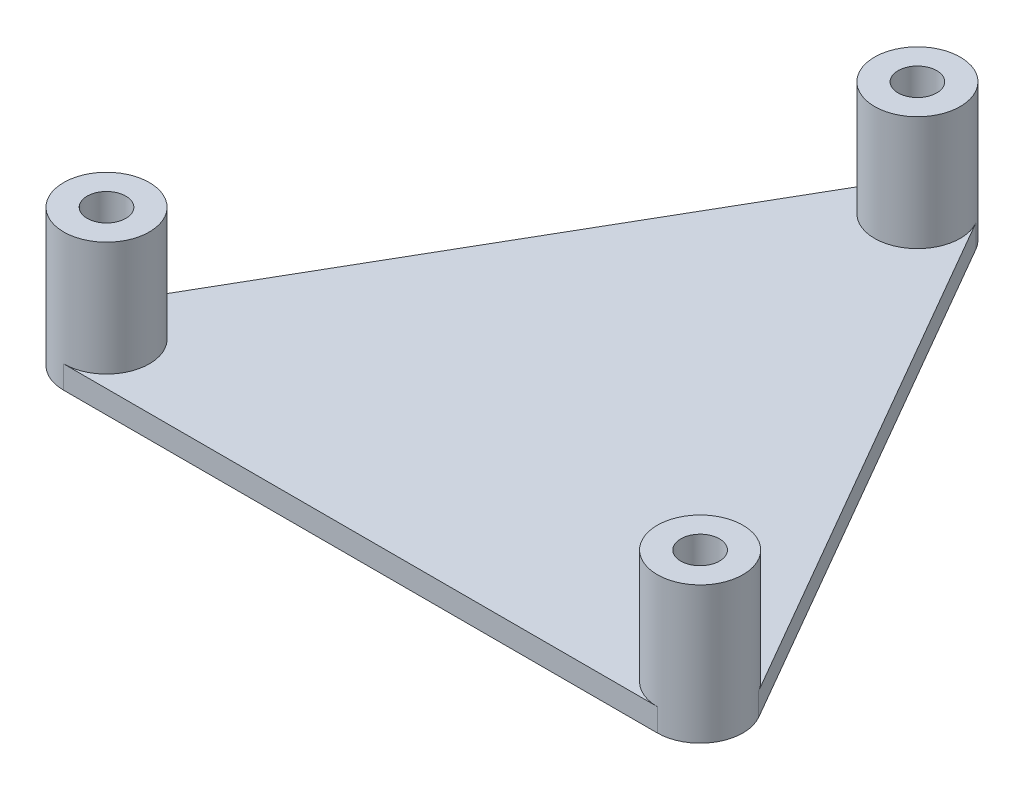
ISO-10303-21;
HEADER;
FILE_DESCRIPTION(('STEP AP214'),'2;1');
FILE_NAME('part.step','',(''),(''),'','','');
FILE_SCHEMA(('AUTOMOTIVE_DESIGN { 1 0 10303 214 1 1 1 1 }'));
ENDSEC;
DATA;
#1=APPLICATION_CONTEXT('core data for automotive mechanical design processes');
#2=APPLICATION_PROTOCOL_DEFINITION('international standard','automotive_design',2000,#1);
#3=PRODUCT_CONTEXT('',#1,'mechanical');
#4=PRODUCT('Part','Part','',(#3));
#5=PRODUCT_RELATED_PRODUCT_CATEGORY('part','',(#4));
#6=PRODUCT_DEFINITION_FORMATION('','',#4);
#7=PRODUCT_DEFINITION_CONTEXT('part definition',#1,'design');
#8=PRODUCT_DEFINITION('design','',#6,#7);
#9=PRODUCT_DEFINITION_SHAPE('','',#8);
#10=(LENGTH_UNIT() NAMED_UNIT(*) SI_UNIT(.MILLI.,.METRE.));
#11=(NAMED_UNIT(*) PLANE_ANGLE_UNIT() SI_UNIT($,.RADIAN.));
#12=(NAMED_UNIT(*) SI_UNIT($,.STERADIAN.) SOLID_ANGLE_UNIT());
#13=UNCERTAINTY_MEASURE_WITH_UNIT(LENGTH_MEASURE(1.E-05),#10,'distance_accuracy_value','');
#14=(GEOMETRIC_REPRESENTATION_CONTEXT(3) GLOBAL_UNCERTAINTY_ASSIGNED_CONTEXT((#13)) GLOBAL_UNIT_ASSIGNED_CONTEXT((#10,
#11,#12)) REPRESENTATION_CONTEXT('',''));
#15=CARTESIAN_POINT('',(0.,0.,0.));
#16=DIRECTION('',(0.,0.,1.));
#17=DIRECTION('',(1.,0.,0.));
#18=AXIS2_PLACEMENT_3D('',#15,#16,#17);
#19=CARTESIAN_POINT('',(0.,2.54,0.));
#20=DIRECTION('',(0.,1.,0.));
#21=DIRECTION('',(0.,0.,1.));
#22=AXIS2_PLACEMENT_3D('',#19,#20,#21);
#23=PLANE('',#22);
#24=DIRECTION('',(-0.499999999999972,0.,0.866025403784455));
#25=VECTOR('',#24,1.);
#26=CARTESIAN_POINT('',(-20.6222299276164,2.54,-11.9062499999988));
#27=LINE('',#26,#25);
#28=CARTESIAN_POINT('',(-4.12444598552347,2.54,-40.4812499999999));
#29=VERTEX_POINT('',#28);
#30=CARTESIAN_POINT('',(-37.1200138697081,2.54,16.6687500000001));
#31=VERTEX_POINT('',#30);
#32=EDGE_CURVE('E162',#29,#31,#27,.T.);
#33=ORIENTED_EDGE('',*,*,#32,.T.);
#34=CARTESIAN_POINT('',(-32.9955678841846,2.54,19.05));
#35=DIRECTION('',(0.,1.,0.));
#36=DIRECTION('',(0.,0.,1.));
#37=AXIS2_PLACEMENT_3D('',#34,#35,#36);
#38=CIRCLE('',#37,4.7625);
#39=CARTESIAN_POINT('',(-32.9955678841846,2.54,23.8125));
#40=VERTEX_POINT('',#39);
#41=EDGE_CURVE('E157',#40,#31,#38,.T.);
#42=ORIENTED_EDGE('',*,*,#41,.F.);
#43=DIRECTION('',(1.,0.,0.));
#44=VECTOR('',#43,1.);
#45=CARTESIAN_POINT('',(0.,2.54,23.8125));
#46=LINE('',#45,#44);
#47=CARTESIAN_POINT('',(32.9955678841883,2.54,23.8125));
#48=VERTEX_POINT('',#47);
#49=EDGE_CURVE('E143',#40,#48,#46,.T.);
#50=ORIENTED_EDGE('',*,*,#49,.T.);
#51=CARTESIAN_POINT('',(32.9955678841883,2.54,19.0499999999979));
#52=DIRECTION('',(0.,1.,0.));
#53=DIRECTION('',(0.,0.,1.));
#54=AXIS2_PLACEMENT_3D('',#51,#52,#53);
#55=CIRCLE('',#54,4.7625);
#56=CARTESIAN_POINT('',(37.1200138697117,2.54,16.6687499999977));
#57=VERTEX_POINT('',#56);
#58=EDGE_CURVE('E176',#57,#48,#55,.T.);
#59=ORIENTED_EDGE('',*,*,#58,.F.);
#60=DIRECTION('',(0.500000000000028,0.,0.866025403784422));
#61=VECTOR('',#60,1.);
#62=CARTESIAN_POINT('',(20.6222299276175,2.54,-11.9062500000012));
#63=LINE('',#62,#61);
#64=CARTESIAN_POINT('',(4.12444598552331,2.54,-40.4812500000001));
#65=VERTEX_POINT('',#64);
#66=EDGE_CURVE('E194',#65,#57,#63,.T.);
#67=ORIENTED_EDGE('',*,*,#66,.F.);
#68=CARTESIAN_POINT('',(0.,2.54,-38.1));
#69=DIRECTION('',(0.,1.,0.));
#70=DIRECTION('',(0.,0.,1.));
#71=AXIS2_PLACEMENT_3D('',#68,#69,#70);
#72=CIRCLE('',#71,4.7625);
#73=EDGE_CURVE('E12',#29,#65,#72,.T.);
#74=ORIENTED_EDGE('',*,*,#73,.F.);
#75=EDGE_LOOP('',(#33,#42,#50,#59,#67,#74));
#76=FACE_BOUND('',#75,.T.);
#77=ADVANCED_FACE('F83',(#76),#23,.T.);
#78=CARTESIAN_POINT('',(0.,0.,0.));
#79=DIRECTION('',(0.,1.,0.));
#80=DIRECTION('',(0.,0.,1.));
#81=AXIS2_PLACEMENT_3D('',#78,#79,#80);
#82=PLANE('',#81);
#83=CARTESIAN_POINT('',(-32.9955678841846,0.,19.05));
#84=DIRECTION('',(0.,1.,0.));
#85=DIRECTION('',(0.,0.,1.));
#86=AXIS2_PLACEMENT_3D('',#83,#84,#85);
#87=CIRCLE('',#86,2.15);
#88=CARTESIAN_POINT('',(-32.9955678841846,0.,21.2));
#89=VERTEX_POINT('',#88);
#90=EDGE_CURVE('E204',#89,#89,#87,.T.);
#91=ORIENTED_EDGE('',*,*,#90,.T.);
#92=EDGE_LOOP('',(#91));
#93=FACE_BOUND('',#92,.T.);
#94=CARTESIAN_POINT('',(0.,0.,-38.1));
#95=DIRECTION('',(0.,1.,0.));
#96=DIRECTION('',(0.,0.,1.));
#97=AXIS2_PLACEMENT_3D('',#94,#95,#96);
#98=CIRCLE('',#97,2.15);
#99=CARTESIAN_POINT('',(0.,0.,-35.95));
#100=VERTEX_POINT('',#99);
#101=EDGE_CURVE('E93',#100,#100,#98,.T.);
#102=ORIENTED_EDGE('',*,*,#101,.T.);
#103=EDGE_LOOP('',(#102));
#104=FACE_BOUND('',#103,.T.);
#105=CARTESIAN_POINT('',(32.9955678841883,0.,19.0499999999979));
#106=DIRECTION('',(0.,1.,0.));
#107=DIRECTION('',(0.,0.,1.));
#108=AXIS2_PLACEMENT_3D('',#105,#106,#107);
#109=CIRCLE('',#108,2.15);
#110=CARTESIAN_POINT('',(32.9955678841883,0.,21.1999999999979));
#111=VERTEX_POINT('',#110);
#112=EDGE_CURVE('E207',#111,#111,#109,.T.);
#113=ORIENTED_EDGE('',*,*,#112,.T.);
#114=EDGE_LOOP('',(#113));
#115=FACE_BOUND('',#114,.T.);
#116=CARTESIAN_POINT('',(0.,0.,-38.1));
#117=DIRECTION('',(0.,1.,0.));
#118=DIRECTION('',(0.,0.,1.));
#119=AXIS2_PLACEMENT_3D('',#116,#117,#118);
#120=CIRCLE('',#119,4.7625);
#121=CARTESIAN_POINT('',(4.12444598552332,0.,-40.4812500000001));
#122=VERTEX_POINT('',#121);
#123=CARTESIAN_POINT('',(-4.12444598552347,0.,-40.4812499999999));
#124=VERTEX_POINT('',#123);
#125=EDGE_CURVE('E102',#122,#124,#120,.T.);
#126=ORIENTED_EDGE('',*,*,#125,.F.);
#127=DIRECTION('',(0.500000000000028,0.,0.866025403784422));
#128=VECTOR('',#127,1.);
#129=CARTESIAN_POINT('',(20.6222299276175,0.,-11.9062500000012));
#130=LINE('',#129,#128);
#131=CARTESIAN_POINT('',(37.1200138697117,0.,16.6687499999977));
#132=VERTEX_POINT('',#131);
#133=EDGE_CURVE('E188',#122,#132,#130,.T.);
#134=ORIENTED_EDGE('',*,*,#133,.T.);
#135=CARTESIAN_POINT('',(32.9955678841883,0.,19.0499999999979));
#136=DIRECTION('',(0.,1.,0.));
#137=DIRECTION('',(0.,0.,1.));
#138=AXIS2_PLACEMENT_3D('',#135,#136,#137);
#139=CIRCLE('',#138,4.76250000000108);
#140=CARTESIAN_POINT('',(32.9955678841883,0.,23.8125));
#141=VERTEX_POINT('',#140);
#142=EDGE_CURVE('E160',#141,#132,#139,.T.);
#143=ORIENTED_EDGE('',*,*,#142,.F.);
#144=DIRECTION('',(1.,0.,0.));
#145=VECTOR('',#144,1.);
#146=CARTESIAN_POINT('',(0.,0.,23.8125));
#147=LINE('',#146,#145);
#148=CARTESIAN_POINT('',(-32.9955678841846,0.,23.8125));
#149=VERTEX_POINT('',#148);
#150=EDGE_CURVE('E122',#149,#141,#147,.T.);
#151=ORIENTED_EDGE('',*,*,#150,.F.);
#152=CARTESIAN_POINT('',(-32.9955678841846,0.,19.05));
#153=DIRECTION('',(0.,1.,0.));
#154=DIRECTION('',(0.,0.,1.));
#155=AXIS2_PLACEMENT_3D('',#152,#153,#154);
#156=CIRCLE('',#155,4.76250000000001);
#157=CARTESIAN_POINT('',(-37.1200138697081,0.,16.6687500000001));
#158=VERTEX_POINT('',#157);
#159=EDGE_CURVE('E159',#158,#149,#156,.T.);
#160=ORIENTED_EDGE('',*,*,#159,.F.);
#161=DIRECTION('',(-0.499999999999972,0.,0.866025403784455));
#162=VECTOR('',#161,1.);
#163=CARTESIAN_POINT('',(-20.6222299276164,0.,-11.9062499999988));
#164=LINE('',#163,#162);
#165=EDGE_CURVE('E200',#124,#158,#164,.T.);
#166=ORIENTED_EDGE('',*,*,#165,.F.);
#167=EDGE_LOOP('',(#126,#134,#143,#151,#160,#166));
#168=FACE_BOUND('',#167,.T.);
#169=ADVANCED_FACE('F85',(#93,#104,#115,#168),#82,.F.);
#170=CARTESIAN_POINT('',(0.,2.54,-38.1));
#171=DIRECTION('',(0.,-1.,0.));
#172=DIRECTION('',(0.,0.,-1.));
#173=AXIS2_PLACEMENT_3D('',#170,#171,#172);
#174=CYLINDRICAL_SURFACE('',#173,2.15);
#175=ORIENTED_EDGE('',*,*,#101,.F.);
#176=EDGE_LOOP('',(#175));
#177=FACE_BOUND('',#176,.T.);
#178=CARTESIAN_POINT('',(0.,15.24,-38.1));
#179=DIRECTION('',(0.,1.,0.));
#180=DIRECTION('',(0.,0.,1.));
#181=AXIS2_PLACEMENT_3D('',#178,#179,#180);
#182=CIRCLE('',#181,2.15);
#183=CARTESIAN_POINT('',(0.,15.24,-35.95));
#184=VERTEX_POINT('',#183);
#185=EDGE_CURVE('E180',#184,#184,#182,.T.);
#186=ORIENTED_EDGE('',*,*,#185,.T.);
#187=EDGE_LOOP('',(#186));
#188=FACE_BOUND('',#187,.T.);
#189=ADVANCED_FACE('F252',(#177,#188),#174,.F.);
#190=CARTESIAN_POINT('',(32.9955678841883,2.54,19.0499999999979));
#191=DIRECTION('',(0.,-1.,0.));
#192=DIRECTION('',(0.,0.,-1.));
#193=AXIS2_PLACEMENT_3D('',#190,#191,#192);
#194=CYLINDRICAL_SURFACE('',#193,2.15);
#195=ORIENTED_EDGE('',*,*,#112,.F.);
#196=EDGE_LOOP('',(#195));
#197=FACE_BOUND('',#196,.T.);
#198=CARTESIAN_POINT('',(32.9955678841883,15.24,19.0499999999979));
#199=DIRECTION('',(0.,1.,0.));
#200=DIRECTION('',(0.,0.,1.));
#201=AXIS2_PLACEMENT_3D('',#198,#199,#200);
#202=CIRCLE('',#201,2.15);
#203=CARTESIAN_POINT('',(32.9955678841883,15.24,21.1999999999979));
#204=VERTEX_POINT('',#203);
#205=EDGE_CURVE('E168',#204,#204,#202,.T.);
#206=ORIENTED_EDGE('',*,*,#205,.T.);
#207=EDGE_LOOP('',(#206));
#208=FACE_BOUND('',#207,.T.);
#209=ADVANCED_FACE('F257',(#197,#208),#194,.F.);
#210=CARTESIAN_POINT('',(-32.9955678841846,2.54,19.05));
#211=DIRECTION('',(0.,-1.,0.));
#212=DIRECTION('',(0.,0.,-1.));
#213=AXIS2_PLACEMENT_3D('',#210,#211,#212);
#214=CYLINDRICAL_SURFACE('',#213,2.15);
#215=ORIENTED_EDGE('',*,*,#90,.F.);
#216=EDGE_LOOP('',(#215));
#217=FACE_BOUND('',#216,.T.);
#218=CARTESIAN_POINT('',(-32.9955678841846,15.24,19.05));
#219=DIRECTION('',(0.,1.,0.));
#220=DIRECTION('',(0.,0.,1.));
#221=AXIS2_PLACEMENT_3D('',#218,#219,#220);
#222=CIRCLE('',#221,2.15);
#223=CARTESIAN_POINT('',(-32.9955678841846,15.24,21.2));
#224=VERTEX_POINT('',#223);
#225=EDGE_CURVE('E164',#224,#224,#222,.T.);
#226=ORIENTED_EDGE('',*,*,#225,.T.);
#227=EDGE_LOOP('',(#226));
#228=FACE_BOUND('',#227,.T.);
#229=ADVANCED_FACE('F261',(#217,#228),#214,.F.);
#230=CARTESIAN_POINT('',(0.,0.,-38.1));
#231=DIRECTION('',(0.,1.,0.));
#232=DIRECTION('',(0.,0.,1.));
#233=AXIS2_PLACEMENT_3D('',#230,#231,#232);
#234=CYLINDRICAL_SURFACE('',#233,4.7625);
#235=DIRECTION('',(0.,1.,0.));
#236=VECTOR('',#235,1.);
#237=CARTESIAN_POINT('',(-4.12444598552347,0.,-40.4812499999999));
#238=LINE('',#237,#236);
#239=EDGE_CURVE('E203',#124,#29,#238,.T.);
#240=ORIENTED_EDGE('',*,*,#239,.T.);
#241=ORIENTED_EDGE('',*,*,#73,.T.);
#242=DIRECTION('',(0.,1.,0.));
#243=VECTOR('',#242,1.);
#244=CARTESIAN_POINT('',(4.12444598552332,0.,-40.4812500000001));
#245=LINE('',#244,#243);
#246=EDGE_CURVE('E187',#122,#65,#245,.T.);
#247=ORIENTED_EDGE('',*,*,#246,.F.);
#248=ORIENTED_EDGE('',*,*,#125,.T.);
#249=EDGE_LOOP('',(#240,#241,#247,#248));
#250=FACE_BOUND('',#249,.T.);
#251=CARTESIAN_POINT('',(0.,15.24,-38.1));
#252=DIRECTION('',(0.,1.,0.));
#253=DIRECTION('',(0.,0.,1.));
#254=AXIS2_PLACEMENT_3D('',#251,#252,#253);
#255=CIRCLE('',#254,4.7625);
#256=CARTESIAN_POINT('',(0.,15.24,-33.3375));
#257=VERTEX_POINT('',#256);
#258=EDGE_CURVE('E184',#257,#257,#255,.T.);
#259=ORIENTED_EDGE('',*,*,#258,.F.);
#260=EDGE_LOOP('',(#259));
#261=FACE_BOUND('',#260,.T.);
#262=ADVANCED_FACE('F221',(#250,#261),#234,.T.);
#263=CARTESIAN_POINT('',(-20.6222299276164,0.,-11.9062499999988));
#264=DIRECTION('',(-0.866025403784455,0.,-0.499999999999972));
#265=DIRECTION('',(-0.499999999999972,0.,0.866025403784455));
#266=AXIS2_PLACEMENT_3D('',#263,#264,#265);
#267=PLANE('',#266);
#268=ORIENTED_EDGE('',*,*,#32,.F.);
#269=ORIENTED_EDGE('',*,*,#239,.F.);
#270=ORIENTED_EDGE('',*,*,#165,.T.);
#271=DIRECTION('',(0.,1.,0.));
#272=VECTOR('',#271,1.);
#273=CARTESIAN_POINT('',(-37.1200138697081,0.,16.6687500000001));
#274=LINE('',#273,#272);
#275=EDGE_CURVE('E113',#158,#31,#274,.T.);
#276=ORIENTED_EDGE('',*,*,#275,.T.);
#277=EDGE_LOOP('',(#268,#269,#270,#276));
#278=FACE_BOUND('',#277,.T.);
#279=ADVANCED_FACE('F224',(#278),#267,.T.);
#280=CARTESIAN_POINT('',(-32.9955678841846,0.,19.05));
#281=DIRECTION('',(0.,1.,0.));
#282=DIRECTION('',(0.,0.,1.));
#283=AXIS2_PLACEMENT_3D('',#280,#281,#282);
#284=CYLINDRICAL_SURFACE('',#283,4.76250000000001);
#285=DIRECTION('',(0.,1.,0.));
#286=VECTOR('',#285,1.);
#287=CARTESIAN_POINT('',(-32.9955678841846,0.,23.8125));
#288=LINE('',#287,#286);
#289=EDGE_CURVE('E146',#149,#40,#288,.T.);
#290=ORIENTED_EDGE('',*,*,#289,.T.);
#291=ORIENTED_EDGE('',*,*,#41,.T.);
#292=ORIENTED_EDGE('',*,*,#275,.F.);
#293=ORIENTED_EDGE('',*,*,#159,.T.);
#294=EDGE_LOOP('',(#290,#291,#292,#293));
#295=FACE_BOUND('',#294,.T.);
#296=CARTESIAN_POINT('',(-32.9955678841846,15.24,19.05));
#297=DIRECTION('',(0.,1.,0.));
#298=DIRECTION('',(0.,0.,1.));
#299=AXIS2_PLACEMENT_3D('',#296,#297,#298);
#300=CIRCLE('',#299,4.7625);
#301=CARTESIAN_POINT('',(-32.9955678841846,15.24,23.8125));
#302=VERTEX_POINT('',#301);
#303=EDGE_CURVE('E163',#302,#302,#300,.T.);
#304=ORIENTED_EDGE('',*,*,#303,.F.);
#305=EDGE_LOOP('',(#304));
#306=FACE_BOUND('',#305,.T.);
#307=ADVANCED_FACE('F155',(#295,#306),#284,.T.);
#308=CARTESIAN_POINT('',(32.9955678841883,0.,19.0499999999979));
#309=DIRECTION('',(0.,1.,0.));
#310=DIRECTION('',(0.,0.,1.));
#311=AXIS2_PLACEMENT_3D('',#308,#309,#310);
#312=CYLINDRICAL_SURFACE('',#311,4.76250000000108);
#313=DIRECTION('',(0.,1.,0.));
#314=VECTOR('',#313,1.);
#315=CARTESIAN_POINT('',(37.1200138697117,0.,16.6687499999977));
#316=LINE('',#315,#314);
#317=EDGE_CURVE('E191',#132,#57,#316,.T.);
#318=ORIENTED_EDGE('',*,*,#317,.T.);
#319=ORIENTED_EDGE('',*,*,#58,.T.);
#320=DIRECTION('',(0.,1.,0.));
#321=VECTOR('',#320,1.);
#322=CARTESIAN_POINT('',(32.9955678841883,0.,23.8125));
#323=LINE('',#322,#321);
#324=EDGE_CURVE('E147',#141,#48,#323,.T.);
#325=ORIENTED_EDGE('',*,*,#324,.F.);
#326=ORIENTED_EDGE('',*,*,#142,.T.);
#327=EDGE_LOOP('',(#318,#319,#325,#326));
#328=FACE_BOUND('',#327,.T.);
#329=CARTESIAN_POINT('',(32.9955678841883,15.24,19.0499999999979));
#330=DIRECTION('',(0.,1.,0.));
#331=DIRECTION('',(0.,0.,1.));
#332=AXIS2_PLACEMENT_3D('',#329,#330,#331);
#333=CIRCLE('',#332,4.7625);
#334=CARTESIAN_POINT('',(32.9955678841883,15.24,23.8124999999979));
#335=VERTEX_POINT('',#334);
#336=EDGE_CURVE('E177',#335,#335,#333,.T.);
#337=ORIENTED_EDGE('',*,*,#336,.F.);
#338=EDGE_LOOP('',(#337));
#339=FACE_BOUND('',#338,.T.);
#340=ADVANCED_FACE('F230',(#328,#339),#312,.T.);
#341=CARTESIAN_POINT('',(0.,0.,23.8125));
#342=DIRECTION('',(0.,0.,1.));
#343=DIRECTION('',(1.,0.,0.));
#344=AXIS2_PLACEMENT_3D('',#341,#342,#343);
#345=PLANE('',#344);
#346=ORIENTED_EDGE('',*,*,#49,.F.);
#347=ORIENTED_EDGE('',*,*,#289,.F.);
#348=ORIENTED_EDGE('',*,*,#150,.T.);
#349=ORIENTED_EDGE('',*,*,#324,.T.);
#350=EDGE_LOOP('',(#346,#347,#348,#349));
#351=FACE_BOUND('',#350,.T.);
#352=ADVANCED_FACE('F145',(#351),#345,.T.);
#353=CARTESIAN_POINT('',(20.6222299276175,0.,-11.9062500000012));
#354=DIRECTION('',(-0.866025403784422,0.,0.500000000000028));
#355=DIRECTION('',(0.500000000000028,0.,0.866025403784423));
#356=AXIS2_PLACEMENT_3D('',#353,#354,#355);
#357=PLANE('',#356);
#358=ORIENTED_EDGE('',*,*,#66,.T.);
#359=ORIENTED_EDGE('',*,*,#317,.F.);
#360=ORIENTED_EDGE('',*,*,#133,.F.);
#361=ORIENTED_EDGE('',*,*,#246,.T.);
#362=EDGE_LOOP('',(#358,#359,#360,#361));
#363=FACE_BOUND('',#362,.T.);
#364=ADVANCED_FACE('F233',(#363),#357,.F.);
#365=CARTESIAN_POINT('',(0.,15.24,-38.1));
#366=DIRECTION('',(0.,1.,0.));
#367=DIRECTION('',(0.,0.,1.));
#368=AXIS2_PLACEMENT_3D('',#365,#366,#367);
#369=PLANE('',#368);
#370=ORIENTED_EDGE('',*,*,#258,.T.);
#371=EDGE_LOOP('',(#370));
#372=FACE_BOUND('',#371,.T.);
#373=ORIENTED_EDGE('',*,*,#185,.F.);
#374=EDGE_LOOP('',(#373));
#375=FACE_BOUND('',#374,.T.);
#376=ADVANCED_FACE('F237',(#372,#375),#369,.T.);
#377=CARTESIAN_POINT('',(32.9955678841883,15.24,19.0499999999979));
#378=DIRECTION('',(0.,1.,0.));
#379=DIRECTION('',(0.,0.,1.));
#380=AXIS2_PLACEMENT_3D('',#377,#378,#379);
#381=PLANE('',#380);
#382=ORIENTED_EDGE('',*,*,#336,.T.);
#383=EDGE_LOOP('',(#382));
#384=FACE_BOUND('',#383,.T.);
#385=ORIENTED_EDGE('',*,*,#205,.F.);
#386=EDGE_LOOP('',(#385));
#387=FACE_BOUND('',#386,.T.);
#388=ADVANCED_FACE('F243',(#384,#387),#381,.T.);
#389=CARTESIAN_POINT('',(-32.9955678841846,15.24,19.05));
#390=DIRECTION('',(0.,1.,0.));
#391=DIRECTION('',(0.,0.,1.));
#392=AXIS2_PLACEMENT_3D('',#389,#390,#391);
#393=PLANE('',#392);
#394=ORIENTED_EDGE('',*,*,#303,.T.);
#395=EDGE_LOOP('',(#394));
#396=FACE_BOUND('',#395,.T.);
#397=ORIENTED_EDGE('',*,*,#225,.F.);
#398=EDGE_LOOP('',(#397));
#399=FACE_BOUND('',#398,.T.);
#400=ADVANCED_FACE('F301',(#396,#399),#393,.T.);
#401=CLOSED_SHELL('',(#77,#169,#189,#209,#229,#262,#279,#307,#340,#352,#364,#376,#388,#400));
#402=MANIFOLD_SOLID_BREP('B2',#401);
#403=ADVANCED_BREP_SHAPE_REPRESENTATION('',(#18,#402),#14);
#404=SHAPE_DEFINITION_REPRESENTATION(#9,#403);
ENDSEC;
END-ISO-10303-21;
